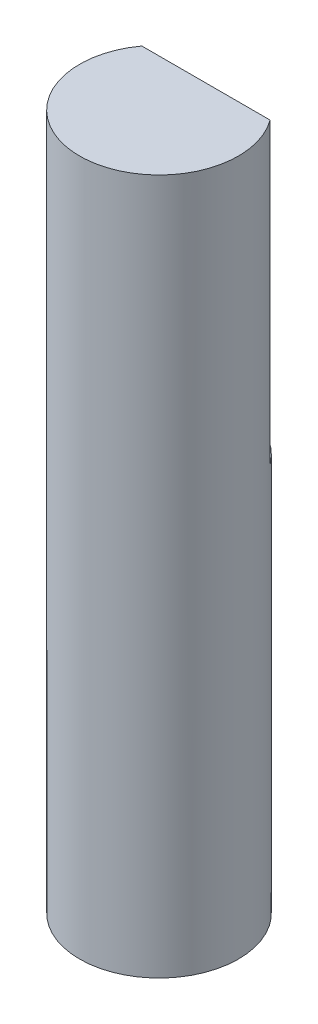
ISO-10303-21;
HEADER;
FILE_DESCRIPTION(('STEP AP214'),'2;1');
FILE_NAME('part.step','',(''),(''),'','','');
FILE_SCHEMA(('AUTOMOTIVE_DESIGN { 1 0 10303 214 1 1 1 1 }'));
ENDSEC;
DATA;
#1=APPLICATION_CONTEXT('core data for automotive mechanical design processes');
#2=APPLICATION_PROTOCOL_DEFINITION('international standard','automotive_design',2000,#1);
#3=PRODUCT_CONTEXT('',#1,'mechanical');
#4=PRODUCT('Part','Part','',(#3));
#5=PRODUCT_RELATED_PRODUCT_CATEGORY('part','',(#4));
#6=PRODUCT_DEFINITION_FORMATION('','',#4);
#7=PRODUCT_DEFINITION_CONTEXT('part definition',#1,'design');
#8=PRODUCT_DEFINITION('design','',#6,#7);
#9=PRODUCT_DEFINITION_SHAPE('','',#8);
#10=(LENGTH_UNIT() NAMED_UNIT(*) SI_UNIT(.MILLI.,.METRE.));
#11=(NAMED_UNIT(*) PLANE_ANGLE_UNIT() SI_UNIT($,.RADIAN.));
#12=(NAMED_UNIT(*) SI_UNIT($,.STERADIAN.) SOLID_ANGLE_UNIT());
#13=UNCERTAINTY_MEASURE_WITH_UNIT(LENGTH_MEASURE(1.E-05),#10,'distance_accuracy_value','');
#14=(GEOMETRIC_REPRESENTATION_CONTEXT(3) GLOBAL_UNCERTAINTY_ASSIGNED_CONTEXT((#13)) GLOBAL_UNIT_ASSIGNED_CONTEXT((#10,
#11,#12)) REPRESENTATION_CONTEXT('',''));
#15=CARTESIAN_POINT('',(0.,0.,0.));
#16=DIRECTION('',(0.,0.,1.));
#17=DIRECTION('',(1.,0.,0.));
#18=AXIS2_PLACEMENT_3D('',#15,#16,#17);
#19=CARTESIAN_POINT('',(-4.09956095210207,44.45,-3.));
#20=DIRECTION('',(0.,0.,1.));
#21=DIRECTION('',(1.,0.,0.));
#22=AXIS2_PLACEMENT_3D('',#19,#20,#21);
#23=PLANE('',#22);
#24=DIRECTION('',(-1.,0.,0.));
#25=VECTOR('',#24,1.);
#26=CARTESIAN_POINT('',(-4.09956095210207,25.4,-3.));
#27=LINE('',#26,#25);
#28=CARTESIAN_POINT('',(4.09956095210207,25.4,-3.));
#29=VERTEX_POINT('',#28);
#30=CARTESIAN_POINT('',(-4.09956095210207,25.4,-3.));
#31=VERTEX_POINT('',#30);
#32=EDGE_CURVE('E55',#29,#31,#27,.T.);
#33=ORIENTED_EDGE('',*,*,#32,.T.);
#34=DIRECTION('',(0.,-1.,0.));
#35=VECTOR('',#34,1.);
#36=CARTESIAN_POINT('',(-4.09956095210207,44.45,-3.));
#37=LINE('',#36,#35);
#38=CARTESIAN_POINT('',(-4.09956095210207,44.45,-3.));
#39=VERTEX_POINT('',#38);
#40=EDGE_CURVE('E45',#39,#31,#37,.T.);
#41=ORIENTED_EDGE('',*,*,#40,.F.);
#42=DIRECTION('',(-1.,0.,0.));
#43=VECTOR('',#42,1.);
#44=CARTESIAN_POINT('',(-4.09956095210207,44.45,-3.));
#45=LINE('',#44,#43);
#46=CARTESIAN_POINT('',(4.09956095210207,44.45,-3.));
#47=VERTEX_POINT('',#46);
#48=EDGE_CURVE('E61',#47,#39,#45,.T.);
#49=ORIENTED_EDGE('',*,*,#48,.F.);
#50=DIRECTION('',(0.,-1.,0.));
#51=VECTOR('',#50,1.);
#52=CARTESIAN_POINT('',(4.09956095210207,44.45,-3.));
#53=LINE('',#52,#51);
#54=EDGE_CURVE('E11',#47,#29,#53,.T.);
#55=ORIENTED_EDGE('',*,*,#54,.T.);
#56=EDGE_LOOP('',(#33,#41,#49,#55));
#57=FACE_BOUND('',#56,.T.);
#58=ADVANCED_FACE('F37',(#57),#23,.F.);
#59=CARTESIAN_POINT('',(0.,44.45,0.));
#60=DIRECTION('',(0.,-1.,0.));
#61=DIRECTION('',(0.,0.,-1.));
#62=AXIS2_PLACEMENT_3D('',#59,#60,#61);
#63=CYLINDRICAL_SURFACE('',#62,5.08);
#64=CARTESIAN_POINT('',(0.,0.,0.));
#65=DIRECTION('',(0.,1.,0.));
#66=DIRECTION('',(0.,0.,1.));
#67=AXIS2_PLACEMENT_3D('',#64,#65,#66);
#68=CIRCLE('',#67,5.08);
#69=CARTESIAN_POINT('',(0.,0.,5.08));
#70=VERTEX_POINT('',#69);
#71=EDGE_CURVE('E69',#70,#70,#68,.T.);
#72=ORIENTED_EDGE('',*,*,#71,.T.);
#73=EDGE_LOOP('',(#72));
#74=FACE_BOUND('',#73,.T.);
#75=ORIENTED_EDGE('',*,*,#40,.T.);
#76=CARTESIAN_POINT('',(0.,25.4,0.));
#77=DIRECTION('',(0.,-1.,0.));
#78=DIRECTION('',(0.,0.,-1.));
#79=AXIS2_PLACEMENT_3D('',#76,#77,#78);
#80=CIRCLE('',#79,5.08);
#81=EDGE_CURVE('E72',#31,#29,#80,.T.);
#82=ORIENTED_EDGE('',*,*,#81,.T.);
#83=ORIENTED_EDGE('',*,*,#54,.F.);
#84=CARTESIAN_POINT('',(0.,44.45,0.));
#85=DIRECTION('',(0.,1.,0.));
#86=DIRECTION('',(0.,0.,1.));
#87=AXIS2_PLACEMENT_3D('',#84,#85,#86);
#88=CIRCLE('',#87,5.08);
#89=EDGE_CURVE('E65',#39,#47,#88,.T.);
#90=ORIENTED_EDGE('',*,*,#89,.F.);
#91=EDGE_LOOP('',(#75,#82,#83,#90));
#92=FACE_BOUND('',#91,.T.);
#93=ADVANCED_FACE('F39',(#74,#92),#63,.T.);
#94=CARTESIAN_POINT('',(0.,44.45,0.));
#95=DIRECTION('',(0.,1.,0.));
#96=DIRECTION('',(0.,0.,1.));
#97=AXIS2_PLACEMENT_3D('',#94,#95,#96);
#98=PLANE('',#97);
#99=ORIENTED_EDGE('',*,*,#89,.T.);
#100=ORIENTED_EDGE('',*,*,#48,.T.);
#101=EDGE_LOOP('',(#99,#100));
#102=FACE_BOUND('',#101,.T.);
#103=ADVANCED_FACE('F67',(#102),#98,.T.);
#104=CARTESIAN_POINT('',(0.,0.,0.));
#105=DIRECTION('',(0.,1.,0.));
#106=DIRECTION('',(0.,0.,1.));
#107=AXIS2_PLACEMENT_3D('',#104,#105,#106);
#108=PLANE('',#107);
#109=ORIENTED_EDGE('',*,*,#71,.F.);
#110=EDGE_LOOP('',(#109));
#111=FACE_BOUND('',#110,.T.);
#112=ADVANCED_FACE('F82',(#111),#108,.F.);
#113=CARTESIAN_POINT('',(0.,25.4,0.));
#114=DIRECTION('',(0.,-1.,0.));
#115=DIRECTION('',(0.,0.,-1.));
#116=AXIS2_PLACEMENT_3D('',#113,#114,#115);
#117=PLANE('',#116);
#118=ORIENTED_EDGE('',*,*,#81,.F.);
#119=ORIENTED_EDGE('',*,*,#32,.F.);
#120=EDGE_LOOP('',(#118,#119));
#121=FACE_BOUND('',#120,.T.);
#122=ADVANCED_FACE('F75',(#121),#117,.F.);
#123=CLOSED_SHELL('',(#58,#93,#103,#112,#122));
#124=MANIFOLD_SOLID_BREP('B2',#123);
#125=ADVANCED_BREP_SHAPE_REPRESENTATION('',(#18,#124),#14);
#126=SHAPE_DEFINITION_REPRESENTATION(#9,#125);
ENDSEC;
END-ISO-10303-21;
